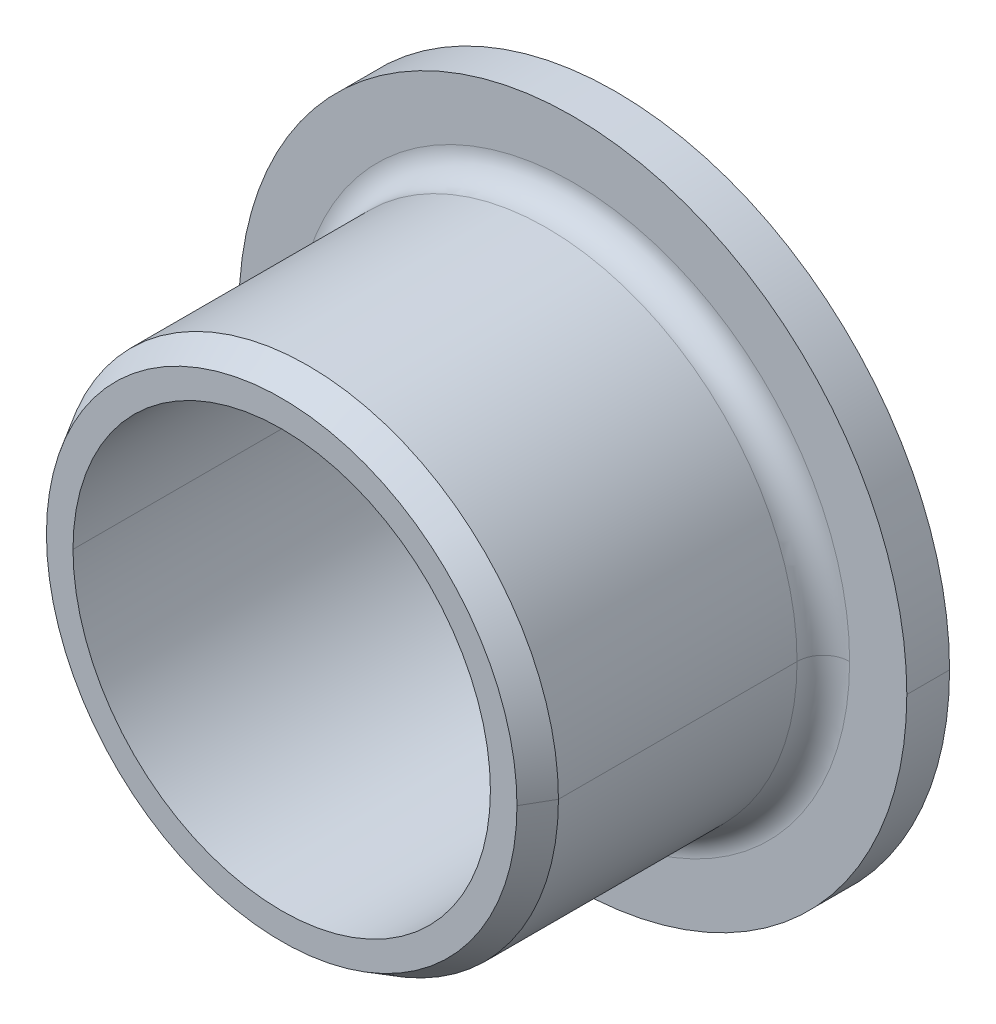
ISO-10303-21;
HEADER;
FILE_DESCRIPTION(('STEP AP214'),'2;1');
FILE_NAME('part.step','',(''),(''),'','','');
FILE_SCHEMA(('AUTOMOTIVE_DESIGN { 1 0 10303 214 1 1 1 1 }'));
ENDSEC;
DATA;
#1=APPLICATION_CONTEXT('core data for automotive mechanical design processes');
#2=APPLICATION_PROTOCOL_DEFINITION('international standard','automotive_design',2000,#1);
#3=PRODUCT_CONTEXT('',#1,'mechanical');
#4=PRODUCT('Part','Part','',(#3));
#5=PRODUCT_RELATED_PRODUCT_CATEGORY('part','',(#4));
#6=PRODUCT_DEFINITION_FORMATION('','',#4);
#7=PRODUCT_DEFINITION_CONTEXT('part definition',#1,'design');
#8=PRODUCT_DEFINITION('design','',#6,#7);
#9=PRODUCT_DEFINITION_SHAPE('','',#8);
#10=(LENGTH_UNIT() NAMED_UNIT(*) SI_UNIT(.MILLI.,.METRE.));
#11=(NAMED_UNIT(*) PLANE_ANGLE_UNIT() SI_UNIT($,.RADIAN.));
#12=(NAMED_UNIT(*) SI_UNIT($,.STERADIAN.) SOLID_ANGLE_UNIT());
#13=UNCERTAINTY_MEASURE_WITH_UNIT(LENGTH_MEASURE(1.E-05),#10,'distance_accuracy_value','');
#14=(GEOMETRIC_REPRESENTATION_CONTEXT(3) GLOBAL_UNCERTAINTY_ASSIGNED_CONTEXT((#13)) GLOBAL_UNIT_ASSIGNED_CONTEXT((#10,
#11,#12)) REPRESENTATION_CONTEXT('',''));
#15=CARTESIAN_POINT('',(0.,0.,0.));
#16=DIRECTION('',(0.,0.,1.));
#17=DIRECTION('',(1.,0.,0.));
#18=AXIS2_PLACEMENT_3D('',#15,#16,#17);
#19=CARTESIAN_POINT('',(5.159375,0.,0.));
#20=DIRECTION('',(0.,0.,-1.));
#21=DIRECTION('',(0.,-1.,0.));
#22=AXIS2_PLACEMENT_3D('',#19,#20,#21);
#23=PLANE('',#22);
#24=CARTESIAN_POINT('',(0.,0.,0.));
#25=DIRECTION('',(0.,0.,1.));
#26=DIRECTION('',(1.,0.,0.));
#27=AXIS2_PLACEMENT_3D('',#24,#25,#26);
#28=CIRCLE('',#27,3.96875);
#29=CARTESIAN_POINT('',(3.96875,0.,0.));
#30=VERTEX_POINT('',#29);
#31=CARTESIAN_POINT('',(-3.96875,0.,0.));
#32=VERTEX_POINT('',#31);
#33=EDGE_CURVE('E10',#30,#32,#28,.T.);
#34=ORIENTED_EDGE('',*,*,#33,.T.);
#35=CARTESIAN_POINT('',(0.,0.,0.));
#36=DIRECTION('',(0.,0.,1.));
#37=DIRECTION('',(1.,0.,0.));
#38=AXIS2_PLACEMENT_3D('',#35,#36,#37);
#39=CIRCLE('',#38,3.96875);
#40=EDGE_CURVE('E141',#32,#30,#39,.T.);
#41=ORIENTED_EDGE('',*,*,#40,.T.);
#42=EDGE_LOOP('',(#34,#41));
#43=FACE_BOUND('',#42,.T.);
#44=CARTESIAN_POINT('',(0.,0.,0.));
#45=DIRECTION('',(0.,0.,1.));
#46=DIRECTION('',(1.,0.,0.));
#47=AXIS2_PLACEMENT_3D('',#44,#45,#46);
#48=CIRCLE('',#47,6.35);
#49=CARTESIAN_POINT('',(6.35,0.,0.));
#50=VERTEX_POINT('',#49);
#51=CARTESIAN_POINT('',(-6.35,0.,0.));
#52=VERTEX_POINT('',#51);
#53=EDGE_CURVE('E142',#50,#52,#48,.T.);
#54=ORIENTED_EDGE('',*,*,#53,.F.);
#55=CARTESIAN_POINT('',(0.,0.,0.));
#56=DIRECTION('',(0.,0.,1.));
#57=DIRECTION('',(1.,0.,0.));
#58=AXIS2_PLACEMENT_3D('',#55,#56,#57);
#59=CIRCLE('',#58,6.35);
#60=EDGE_CURVE('E186',#52,#50,#59,.T.);
#61=ORIENTED_EDGE('',*,*,#60,.F.);
#62=EDGE_LOOP('',(#54,#61));
#63=FACE_BOUND('',#62,.T.);
#64=ADVANCED_FACE('F16',(#43,#63),#23,.T.);
#65=CARTESIAN_POINT('',(0.,0.,3.175));
#66=DIRECTION('',(0.,0.,1.));
#67=DIRECTION('',(1.,0.,0.));
#68=AXIS2_PLACEMENT_3D('',#65,#66,#67);
#69=CYLINDRICAL_SURFACE('',#68,3.96875);
#70=DIRECTION('',(0.,0.,1.));
#71=VECTOR('',#70,1.);
#72=CARTESIAN_POINT('',(3.96875,0.,3.175));
#73=LINE('',#72,#71);
#74=CARTESIAN_POINT('',(3.96875,0.,6.35));
#75=VERTEX_POINT('',#74);
#76=EDGE_CURVE('E137',#30,#75,#73,.T.);
#77=ORIENTED_EDGE('',*,*,#76,.T.);
#78=CARTESIAN_POINT('',(0.,0.,6.35));
#79=DIRECTION('',(0.,0.,1.));
#80=DIRECTION('',(1.,0.,0.));
#81=AXIS2_PLACEMENT_3D('',#78,#79,#80);
#82=CIRCLE('',#81,3.96875);
#83=CARTESIAN_POINT('',(-3.96875,0.,6.35));
#84=VERTEX_POINT('',#83);
#85=EDGE_CURVE('E27',#75,#84,#82,.T.);
#86=ORIENTED_EDGE('',*,*,#85,.T.);
#87=DIRECTION('',(0.,0.,-1.));
#88=VECTOR('',#87,1.);
#89=CARTESIAN_POINT('',(-3.96875,0.,3.175));
#90=LINE('',#89,#88);
#91=EDGE_CURVE('E160',#84,#32,#90,.T.);
#92=ORIENTED_EDGE('',*,*,#91,.T.);
#93=ORIENTED_EDGE('',*,*,#33,.F.);
#94=EDGE_LOOP('',(#77,#86,#92,#93));
#95=FACE_BOUND('',#94,.T.);
#96=ADVANCED_FACE('F222',(#95),#69,.F.);
#97=CARTESIAN_POINT('',(4.2212874327,0.,6.35));
#98=DIRECTION('',(0.,0.,1.));
#99=DIRECTION('',(1.,0.,0.));
#100=AXIS2_PLACEMENT_3D('',#97,#98,#99);
#101=PLANE('',#100);
#102=ORIENTED_EDGE('',*,*,#85,.F.);
#103=CARTESIAN_POINT('',(0.,0.,6.35));
#104=DIRECTION('',(0.,0.,1.));
#105=DIRECTION('',(1.,0.,0.));
#106=AXIS2_PLACEMENT_3D('',#103,#104,#105);
#107=CIRCLE('',#106,3.96875);
#108=EDGE_CURVE('E163',#84,#75,#107,.T.);
#109=ORIENTED_EDGE('',*,*,#108,.F.);
#110=EDGE_LOOP('',(#102,#109));
#111=FACE_BOUND('',#110,.T.);
#112=CARTESIAN_POINT('',(0.,0.,6.35));
#113=DIRECTION('',(0.,0.,1.));
#114=DIRECTION('',(1.,0.,0.));
#115=AXIS2_PLACEMENT_3D('',#112,#113,#114);
#116=CIRCLE('',#115,4.4738248654);
#117=CARTESIAN_POINT('',(4.4738248654,0.,6.35));
#118=VERTEX_POINT('',#117);
#119=CARTESIAN_POINT('',(-4.4738248654,0.,6.35));
#120=VERTEX_POINT('',#119);
#121=EDGE_CURVE('E118',#118,#120,#116,.T.);
#122=ORIENTED_EDGE('',*,*,#121,.T.);
#123=CARTESIAN_POINT('',(0.,0.,6.35));
#124=DIRECTION('',(0.,0.,1.));
#125=DIRECTION('',(1.,0.,0.));
#126=AXIS2_PLACEMENT_3D('',#123,#124,#125);
#127=CIRCLE('',#126,4.4738248654);
#128=EDGE_CURVE('E105',#120,#118,#127,.T.);
#129=ORIENTED_EDGE('',*,*,#128,.T.);
#130=EDGE_LOOP('',(#122,#129));
#131=FACE_BOUND('',#130,.T.);
#132=ADVANCED_FACE('F119',(#111,#131),#101,.T.);
#133=CARTESIAN_POINT('',(0.,0.,6.1));
#134=DIRECTION('',(0.,0.,-1.));
#135=DIRECTION('',(1.,0.,0.));
#136=AXIS2_PLACEMENT_3D('',#133,#134,#135);
#137=CONICAL_SURFACE('',#136,4.6181624327,0.52359877560608);
#138=DIRECTION('',(-0.500000000006738,0.,0.866025403780548));
#139=VECTOR('',#138,1.);
#140=CARTESIAN_POINT('',(4.6181624327,0.,6.1));
#141=LINE('',#140,#139);
#142=CARTESIAN_POINT('',(4.7625,0.,5.85));
#143=VERTEX_POINT('',#142);
#144=EDGE_CURVE('E113',#143,#118,#141,.T.);
#145=ORIENTED_EDGE('',*,*,#144,.T.);
#146=ORIENTED_EDGE('',*,*,#128,.F.);
#147=DIRECTION('',(-0.500000000006738,0.,-0.866025403780548));
#148=VECTOR('',#147,1.);
#149=CARTESIAN_POINT('',(-4.6181624327,0.,6.1));
#150=LINE('',#149,#148);
#151=CARTESIAN_POINT('',(-4.7625,0.,5.85));
#152=VERTEX_POINT('',#151);
#153=EDGE_CURVE('E110',#120,#152,#150,.T.);
#154=ORIENTED_EDGE('',*,*,#153,.T.);
#155=CARTESIAN_POINT('',(0.,0.,5.85));
#156=DIRECTION('',(0.,0.,1.));
#157=DIRECTION('',(1.,0.,0.));
#158=AXIS2_PLACEMENT_3D('',#155,#156,#157);
#159=CIRCLE('',#158,4.7625);
#160=EDGE_CURVE('E117',#152,#143,#159,.T.);
#161=ORIENTED_EDGE('',*,*,#160,.T.);
#162=EDGE_LOOP('',(#145,#146,#154,#161));
#163=FACE_BOUND('',#162,.T.);
#164=ADVANCED_FACE('F107',(#163),#137,.T.);
#165=CARTESIAN_POINT('',(0.,0.,3.5814));
#166=DIRECTION('',(0.,0.,1.));
#167=DIRECTION('',(1.,0.,0.));
#168=AXIS2_PLACEMENT_3D('',#165,#166,#167);
#169=CYLINDRICAL_SURFACE('',#168,4.7625);
#170=DIRECTION('',(0.,0.,1.));
#171=VECTOR('',#170,1.);
#172=CARTESIAN_POINT('',(4.7625,0.,3.5814));
#173=LINE('',#172,#171);
#174=CARTESIAN_POINT('',(4.7625,0.,1.3128));
#175=VERTEX_POINT('',#174);
#176=EDGE_CURVE('E122',#175,#143,#173,.T.);
#177=ORIENTED_EDGE('',*,*,#176,.T.);
#178=ORIENTED_EDGE('',*,*,#160,.F.);
#179=DIRECTION('',(0.,0.,-1.));
#180=VECTOR('',#179,1.);
#181=CARTESIAN_POINT('',(-4.7625,0.,3.5814));
#182=LINE('',#181,#180);
#183=CARTESIAN_POINT('',(-4.7625,0.,1.3128));
#184=VERTEX_POINT('',#183);
#185=EDGE_CURVE('E151',#152,#184,#182,.T.);
#186=ORIENTED_EDGE('',*,*,#185,.T.);
#187=CARTESIAN_POINT('',(0.,0.,1.3128));
#188=DIRECTION('',(0.,0.,1.));
#189=DIRECTION('',(1.,0.,0.));
#190=AXIS2_PLACEMENT_3D('',#187,#188,#189);
#191=CIRCLE('',#190,4.7625);
#192=EDGE_CURVE('E83',#184,#175,#191,.T.);
#193=ORIENTED_EDGE('',*,*,#192,.T.);
#194=EDGE_LOOP('',(#177,#178,#186,#193));
#195=FACE_BOUND('',#194,.T.);
#196=ADVANCED_FACE('F197',(#195),#169,.T.);
#197=CARTESIAN_POINT('',(0.,0.,1.3128));
#198=DIRECTION('',(0.,0.,1.));
#199=DIRECTION('',(1.,0.,0.));
#200=AXIS2_PLACEMENT_3D('',#197,#198,#199);
#201=TOROIDAL_SURFACE('',#200,5.2625,0.5);
#202=CARTESIAN_POINT('',(-5.2625,0.,1.3128));
#203=DIRECTION('',(0.,-1.,0.));
#204=DIRECTION('',(-1.,0.,0.));
#205=AXIS2_PLACEMENT_3D('',#202,#203,#204);
#206=CIRCLE('',#205,0.5);
#207=CARTESIAN_POINT('',(-5.2625,0.,0.8128));
#208=VERTEX_POINT('',#207);
#209=EDGE_CURVE('E20',#208,#184,#206,.T.);
#210=ORIENTED_EDGE('',*,*,#209,.T.);
#211=CARTESIAN_POINT('',(0.,0.,1.3128));
#212=DIRECTION('',(0.,0.,1.));
#213=DIRECTION('',(1.,0.,0.));
#214=AXIS2_PLACEMENT_3D('',#211,#212,#213);
#215=CIRCLE('',#214,4.7625);
#216=EDGE_CURVE('E155',#175,#184,#215,.T.);
#217=ORIENTED_EDGE('',*,*,#216,.F.);
#218=CARTESIAN_POINT('',(5.2625,0.,1.3128));
#219=DIRECTION('',(0.,-1.,0.));
#220=DIRECTION('',(1.,0.,0.));
#221=AXIS2_PLACEMENT_3D('',#218,#219,#220);
#222=CIRCLE('',#221,0.5);
#223=CARTESIAN_POINT('',(5.2625,0.,0.8128));
#224=VERTEX_POINT('',#223);
#225=EDGE_CURVE('E156',#175,#224,#222,.T.);
#226=ORIENTED_EDGE('',*,*,#225,.T.);
#227=CARTESIAN_POINT('',(0.,0.,0.8128));
#228=DIRECTION('',(0.,0.,1.));
#229=DIRECTION('',(1.,0.,0.));
#230=AXIS2_PLACEMENT_3D('',#227,#228,#229);
#231=CIRCLE('',#230,5.2625);
#232=EDGE_CURVE('E67',#224,#208,#231,.T.);
#233=ORIENTED_EDGE('',*,*,#232,.T.);
#234=EDGE_LOOP('',(#210,#217,#226,#233));
#235=FACE_BOUND('',#234,.T.);
#236=ADVANCED_FACE('F236',(#235),#201,.F.);
#237=CARTESIAN_POINT('',(5.80625,0.,0.8128));
#238=DIRECTION('',(0.,0.,1.));
#239=DIRECTION('',(1.,0.,0.));
#240=AXIS2_PLACEMENT_3D('',#237,#238,#239);
#241=PLANE('',#240);
#242=ORIENTED_EDGE('',*,*,#232,.F.);
#243=CARTESIAN_POINT('',(0.,0.,0.8128));
#244=DIRECTION('',(0.,0.,1.));
#245=DIRECTION('',(1.,0.,0.));
#246=AXIS2_PLACEMENT_3D('',#243,#244,#245);
#247=CIRCLE('',#246,5.2625);
#248=EDGE_CURVE('E159',#208,#224,#247,.T.);
#249=ORIENTED_EDGE('',*,*,#248,.F.);
#250=EDGE_LOOP('',(#242,#249));
#251=FACE_BOUND('',#250,.T.);
#252=CARTESIAN_POINT('',(0.,0.,0.8128));
#253=DIRECTION('',(0.,0.,1.));
#254=DIRECTION('',(1.,0.,0.));
#255=AXIS2_PLACEMENT_3D('',#252,#253,#254);
#256=CIRCLE('',#255,6.35);
#257=CARTESIAN_POINT('',(6.35,0.,0.8128));
#258=VERTEX_POINT('',#257);
#259=CARTESIAN_POINT('',(-6.35,0.,0.8128));
#260=VERTEX_POINT('',#259);
#261=EDGE_CURVE('E148',#258,#260,#256,.T.);
#262=ORIENTED_EDGE('',*,*,#261,.T.);
#263=CARTESIAN_POINT('',(0.,0.,0.8128));
#264=DIRECTION('',(0.,0.,1.));
#265=DIRECTION('',(1.,0.,0.));
#266=AXIS2_PLACEMENT_3D('',#263,#264,#265);
#267=CIRCLE('',#266,6.35);
#268=EDGE_CURVE('E41',#260,#258,#267,.T.);
#269=ORIENTED_EDGE('',*,*,#268,.T.);
#270=EDGE_LOOP('',(#262,#269));
#271=FACE_BOUND('',#270,.T.);
#272=ADVANCED_FACE('F233',(#251,#271),#241,.T.);
#273=CARTESIAN_POINT('',(0.,0.,0.4064));
#274=DIRECTION('',(0.,0.,1.));
#275=DIRECTION('',(1.,0.,0.));
#276=AXIS2_PLACEMENT_3D('',#273,#274,#275);
#277=CYLINDRICAL_SURFACE('',#276,6.35);
#278=DIRECTION('',(0.,0.,1.));
#279=VECTOR('',#278,1.);
#280=CARTESIAN_POINT('',(6.35,0.,0.4064));
#281=LINE('',#280,#279);
#282=EDGE_CURVE('E147',#50,#258,#281,.T.);
#283=ORIENTED_EDGE('',*,*,#282,.T.);
#284=ORIENTED_EDGE('',*,*,#268,.F.);
#285=DIRECTION('',(0.,0.,-1.));
#286=VECTOR('',#285,1.);
#287=CARTESIAN_POINT('',(-6.35,0.,0.4064));
#288=LINE('',#287,#286);
#289=EDGE_CURVE('E146',#260,#52,#288,.T.);
#290=ORIENTED_EDGE('',*,*,#289,.T.);
#291=ORIENTED_EDGE('',*,*,#60,.T.);
#292=EDGE_LOOP('',(#283,#284,#290,#291));
#293=FACE_BOUND('',#292,.T.);
#294=ADVANCED_FACE('F18',(#293),#277,.T.);
#295=CARTESIAN_POINT('',(0.,0.,0.4064));
#296=DIRECTION('',(0.,0.,1.));
#297=DIRECTION('',(1.,0.,0.));
#298=AXIS2_PLACEMENT_3D('',#295,#296,#297);
#299=CYLINDRICAL_SURFACE('',#298,6.35);
#300=ORIENTED_EDGE('',*,*,#282,.F.);
#301=ORIENTED_EDGE('',*,*,#53,.T.);
#302=ORIENTED_EDGE('',*,*,#289,.F.);
#303=ORIENTED_EDGE('',*,*,#261,.F.);
#304=EDGE_LOOP('',(#300,#301,#302,#303));
#305=FACE_BOUND('',#304,.T.);
#306=ADVANCED_FACE('F219',(#305),#299,.T.);
#307=CARTESIAN_POINT('',(0.,0.,1.3128));
#308=DIRECTION('',(0.,0.,1.));
#309=DIRECTION('',(1.,0.,0.));
#310=AXIS2_PLACEMENT_3D('',#307,#308,#309);
#311=TOROIDAL_SURFACE('',#310,5.2625,0.5);
#312=ORIENTED_EDGE('',*,*,#209,.F.);
#313=ORIENTED_EDGE('',*,*,#248,.T.);
#314=ORIENTED_EDGE('',*,*,#225,.F.);
#315=ORIENTED_EDGE('',*,*,#192,.F.);
#316=EDGE_LOOP('',(#312,#313,#314,#315));
#317=FACE_BOUND('',#316,.T.);
#318=ADVANCED_FACE('F240',(#317),#311,.F.);
#319=CARTESIAN_POINT('',(0.,0.,3.5814));
#320=DIRECTION('',(0.,0.,1.));
#321=DIRECTION('',(1.,0.,0.));
#322=AXIS2_PLACEMENT_3D('',#319,#320,#321);
#323=CYLINDRICAL_SURFACE('',#322,4.7625);
#324=ORIENTED_EDGE('',*,*,#176,.F.);
#325=ORIENTED_EDGE('',*,*,#216,.T.);
#326=ORIENTED_EDGE('',*,*,#185,.F.);
#327=CARTESIAN_POINT('',(0.,0.,5.85));
#328=DIRECTION('',(0.,0.,1.));
#329=DIRECTION('',(1.,0.,0.));
#330=AXIS2_PLACEMENT_3D('',#327,#328,#329);
#331=CIRCLE('',#330,4.7625);
#332=EDGE_CURVE('E126',#143,#152,#331,.T.);
#333=ORIENTED_EDGE('',*,*,#332,.F.);
#334=EDGE_LOOP('',(#324,#325,#326,#333));
#335=FACE_BOUND('',#334,.T.);
#336=ADVANCED_FACE('F200',(#335),#323,.T.);
#337=CARTESIAN_POINT('',(0.,0.,6.1));
#338=DIRECTION('',(0.,0.,-1.));
#339=DIRECTION('',(1.,0.,0.));
#340=AXIS2_PLACEMENT_3D('',#337,#338,#339);
#341=CONICAL_SURFACE('',#340,4.6181624327,0.52359877560608);
#342=ORIENTED_EDGE('',*,*,#144,.F.);
#343=ORIENTED_EDGE('',*,*,#332,.T.);
#344=ORIENTED_EDGE('',*,*,#153,.F.);
#345=ORIENTED_EDGE('',*,*,#121,.F.);
#346=EDGE_LOOP('',(#342,#343,#344,#345));
#347=FACE_BOUND('',#346,.T.);
#348=ADVANCED_FACE('F124',(#347),#341,.T.);
#349=CARTESIAN_POINT('',(0.,0.,3.175));
#350=DIRECTION('',(0.,0.,1.));
#351=DIRECTION('',(1.,0.,0.));
#352=AXIS2_PLACEMENT_3D('',#349,#350,#351);
#353=CYLINDRICAL_SURFACE('',#352,3.96875);
#354=ORIENTED_EDGE('',*,*,#76,.F.);
#355=ORIENTED_EDGE('',*,*,#40,.F.);
#356=ORIENTED_EDGE('',*,*,#91,.F.);
#357=ORIENTED_EDGE('',*,*,#108,.T.);
#358=EDGE_LOOP('',(#354,#355,#356,#357));
#359=FACE_BOUND('',#358,.T.);
#360=ADVANCED_FACE('F349',(#359),#353,.F.);
#361=CLOSED_SHELL('',(#64,#96,#132,#164,#196,#236,#272,#294,#306,#318,#336,#348,#360));
#362=MANIFOLD_SOLID_BREP('B1',#361);
#363=ADVANCED_BREP_SHAPE_REPRESENTATION('',(#18,#362),#14);
#364=SHAPE_DEFINITION_REPRESENTATION(#9,#363);
ENDSEC;
END-ISO-10303-21;
